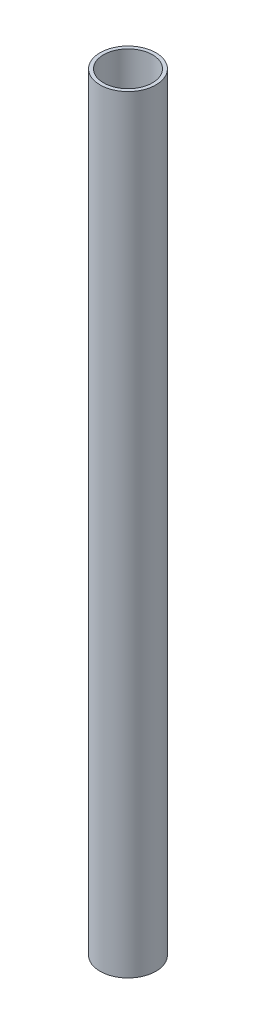
ISO-10303-21;
HEADER;
FILE_DESCRIPTION(('STEP AP214'),'2;1');
FILE_NAME('part.step','',(''),(''),'','','');
FILE_SCHEMA(('AUTOMOTIVE_DESIGN { 1 0 10303 214 1 1 1 1 }'));
ENDSEC;
DATA;
#1=APPLICATION_CONTEXT('core data for automotive mechanical design processes');
#2=APPLICATION_PROTOCOL_DEFINITION('international standard','automotive_design',2000,#1);
#3=PRODUCT_CONTEXT('',#1,'mechanical');
#4=PRODUCT('Part','Part','',(#3));
#5=PRODUCT_RELATED_PRODUCT_CATEGORY('part','',(#4));
#6=PRODUCT_DEFINITION_FORMATION('','',#4);
#7=PRODUCT_DEFINITION_CONTEXT('part definition',#1,'design');
#8=PRODUCT_DEFINITION('design','',#6,#7);
#9=PRODUCT_DEFINITION_SHAPE('','',#8);
#10=(LENGTH_UNIT() NAMED_UNIT(*) SI_UNIT(.MILLI.,.METRE.));
#11=(NAMED_UNIT(*) PLANE_ANGLE_UNIT() SI_UNIT($,.RADIAN.));
#12=(NAMED_UNIT(*) SI_UNIT($,.STERADIAN.) SOLID_ANGLE_UNIT());
#13=UNCERTAINTY_MEASURE_WITH_UNIT(LENGTH_MEASURE(1.E-05),#10,'distance_accuracy_value','');
#14=(GEOMETRIC_REPRESENTATION_CONTEXT(3) GLOBAL_UNCERTAINTY_ASSIGNED_CONTEXT((#13)) GLOBAL_UNIT_ASSIGNED_CONTEXT((#10,
#11,#12)) REPRESENTATION_CONTEXT('',''));
#15=CARTESIAN_POINT('',(0.,0.,0.));
#16=DIRECTION('',(0.,0.,1.));
#17=DIRECTION('',(1.,0.,0.));
#18=AXIS2_PLACEMENT_3D('',#15,#16,#17);
#19=CARTESIAN_POINT('',(0.,1397.,0.));
#20=DIRECTION('',(0.,1.,0.));
#21=DIRECTION('',(0.,0.,1.));
#22=AXIS2_PLACEMENT_3D('',#19,#20,#21);
#23=PLANE('',#22);
#24=CARTESIAN_POINT('',(0.,1397.,0.));
#25=DIRECTION('',(0.,1.,0.));
#26=DIRECTION('',(0.,0.,1.));
#27=AXIS2_PLACEMENT_3D('',#24,#25,#26);
#28=CIRCLE('',#27,50.8);
#29=CARTESIAN_POINT('',(0.,1397.,50.8));
#30=VERTEX_POINT('',#29);
#31=EDGE_CURVE('E10',#30,#30,#28,.T.);
#32=ORIENTED_EDGE('',*,*,#31,.T.);
#33=EDGE_LOOP('',(#32));
#34=FACE_BOUND('',#33,.T.);
#35=CARTESIAN_POINT('',(0.,1397.,0.));
#36=DIRECTION('',(0.,1.,0.));
#37=DIRECTION('',(0.,0.,1.));
#38=AXIS2_PLACEMENT_3D('',#35,#36,#37);
#39=CIRCLE('',#38,44.45);
#40=CARTESIAN_POINT('',(0.,1397.,44.45));
#41=VERTEX_POINT('',#40);
#42=EDGE_CURVE('E42',#41,#41,#39,.T.);
#43=ORIENTED_EDGE('',*,*,#42,.F.);
#44=EDGE_LOOP('',(#43));
#45=FACE_BOUND('',#44,.T.);
#46=ADVANCED_FACE('F31',(#34,#45),#23,.T.);
#47=CARTESIAN_POINT('',(0.,0.,0.));
#48=DIRECTION('',(0.,1.,0.));
#49=DIRECTION('',(0.,0.,1.));
#50=AXIS2_PLACEMENT_3D('',#47,#48,#49);
#51=PLANE('',#50);
#52=CARTESIAN_POINT('',(0.,0.,0.));
#53=DIRECTION('',(0.,1.,0.));
#54=DIRECTION('',(0.,0.,1.));
#55=AXIS2_PLACEMENT_3D('',#52,#53,#54);
#56=CIRCLE('',#55,50.8);
#57=CARTESIAN_POINT('',(0.,0.,50.8));
#58=VERTEX_POINT('',#57);
#59=EDGE_CURVE('E35',#58,#58,#56,.T.);
#60=ORIENTED_EDGE('',*,*,#59,.F.);
#61=EDGE_LOOP('',(#60));
#62=FACE_BOUND('',#61,.T.);
#63=CARTESIAN_POINT('',(0.,0.,0.));
#64=DIRECTION('',(0.,1.,0.));
#65=DIRECTION('',(0.,0.,1.));
#66=AXIS2_PLACEMENT_3D('',#63,#64,#65);
#67=CIRCLE('',#66,44.45);
#68=CARTESIAN_POINT('',(0.,0.,44.45));
#69=VERTEX_POINT('',#68);
#70=EDGE_CURVE('E44',#69,#69,#67,.T.);
#71=ORIENTED_EDGE('',*,*,#70,.T.);
#72=EDGE_LOOP('',(#71));
#73=FACE_BOUND('',#72,.T.);
#74=ADVANCED_FACE('F54',(#62,#73),#51,.F.);
#75=CARTESIAN_POINT('',(0.,1397.,0.));
#76=DIRECTION('',(0.,-1.,0.));
#77=DIRECTION('',(0.,0.,-1.));
#78=AXIS2_PLACEMENT_3D('',#75,#76,#77);
#79=CYLINDRICAL_SURFACE('',#78,50.8);
#80=ORIENTED_EDGE('',*,*,#31,.F.);
#81=EDGE_LOOP('',(#80));
#82=FACE_BOUND('',#81,.T.);
#83=ORIENTED_EDGE('',*,*,#59,.T.);
#84=EDGE_LOOP('',(#83));
#85=FACE_BOUND('',#84,.T.);
#86=ADVANCED_FACE('F33',(#82,#85),#79,.T.);
#87=CARTESIAN_POINT('',(0.,1397.,0.));
#88=DIRECTION('',(0.,-1.,0.));
#89=DIRECTION('',(0.,0.,-1.));
#90=AXIS2_PLACEMENT_3D('',#87,#88,#89);
#91=CYLINDRICAL_SURFACE('',#90,44.45);
#92=ORIENTED_EDGE('',*,*,#42,.T.);
#93=EDGE_LOOP('',(#92));
#94=FACE_BOUND('',#93,.T.);
#95=ORIENTED_EDGE('',*,*,#70,.F.);
#96=EDGE_LOOP('',(#95));
#97=FACE_BOUND('',#96,.T.);
#98=ADVANCED_FACE('F50',(#94,#97),#91,.F.);
#99=CLOSED_SHELL('',(#46,#74,#86,#98));
#100=MANIFOLD_SOLID_BREP('B2',#99);
#101=ADVANCED_BREP_SHAPE_REPRESENTATION('',(#18,#100),#14);
#102=SHAPE_DEFINITION_REPRESENTATION(#9,#101);
ENDSEC;
END-ISO-10303-21;
